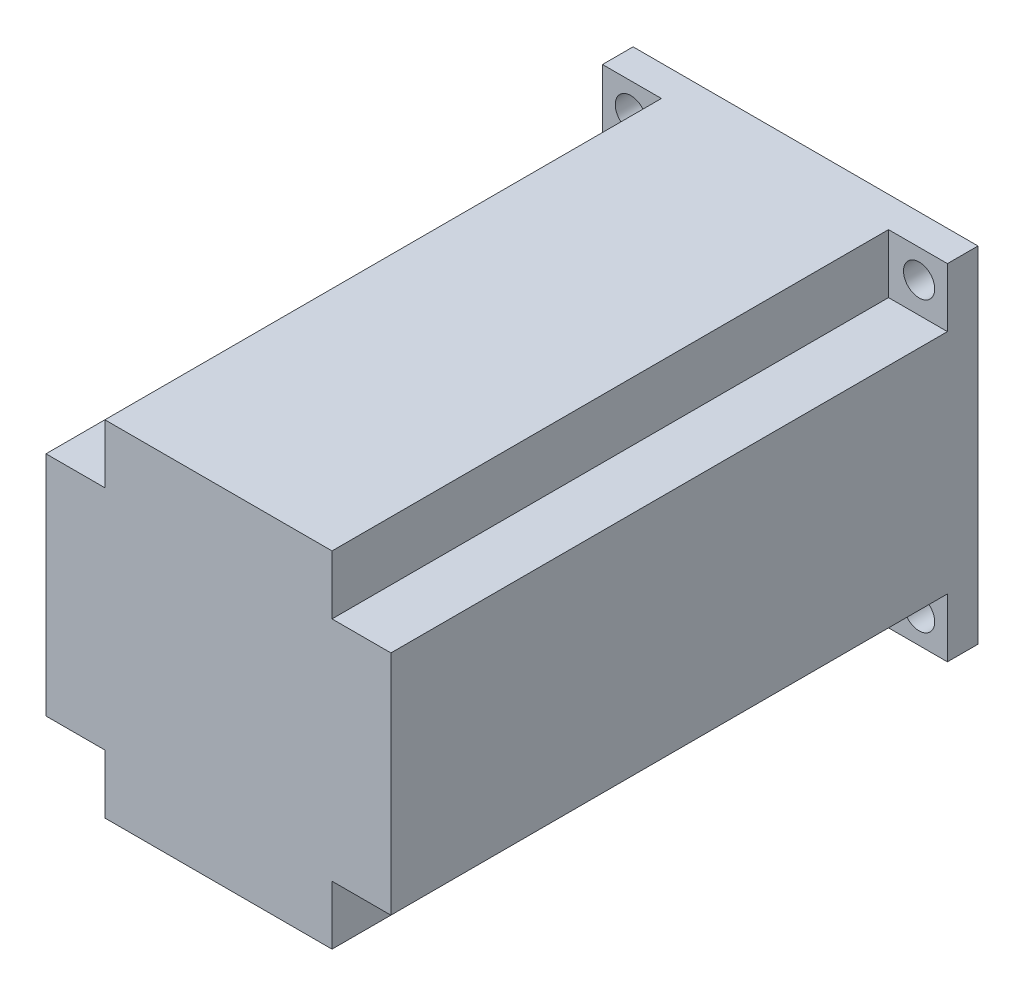
ISO-10303-21;
HEADER;
FILE_DESCRIPTION(('STEP AP214'),'2;1');
FILE_NAME('part.step','',(''),(''),'','','');
FILE_SCHEMA(('AUTOMOTIVE_DESIGN { 1 0 10303 214 1 1 1 1 }'));
ENDSEC;
DATA;
#1=APPLICATION_CONTEXT('core data for automotive mechanical design processes');
#2=APPLICATION_PROTOCOL_DEFINITION('international standard','automotive_design',2000,#1);
#3=PRODUCT_CONTEXT('',#1,'mechanical');
#4=PRODUCT('Part','Part','',(#3));
#5=PRODUCT_RELATED_PRODUCT_CATEGORY('part','',(#4));
#6=PRODUCT_DEFINITION_FORMATION('','',#4);
#7=PRODUCT_DEFINITION_CONTEXT('part definition',#1,'design');
#8=PRODUCT_DEFINITION('design','',#6,#7);
#9=PRODUCT_DEFINITION_SHAPE('','',#8);
#10=(LENGTH_UNIT() NAMED_UNIT(*) SI_UNIT(.MILLI.,.METRE.));
#11=(NAMED_UNIT(*) PLANE_ANGLE_UNIT() SI_UNIT($,.RADIAN.));
#12=(NAMED_UNIT(*) SI_UNIT($,.STERADIAN.) SOLID_ANGLE_UNIT());
#13=UNCERTAINTY_MEASURE_WITH_UNIT(LENGTH_MEASURE(1.E-05),#10,'distance_accuracy_value','');
#14=(GEOMETRIC_REPRESENTATION_CONTEXT(3) GLOBAL_UNCERTAINTY_ASSIGNED_CONTEXT((#13)) GLOBAL_UNIT_ASSIGNED_CONTEXT((#10,
#11,#12)) REPRESENTATION_CONTEXT('',''));
#15=CARTESIAN_POINT('',(0.,0.,0.));
#16=DIRECTION('',(0.,0.,1.));
#17=DIRECTION('',(1.,0.,0.));
#18=AXIS2_PLACEMENT_3D('',#15,#16,#17);
#19=CARTESIAN_POINT('',(0.,0.,96.));
#20=DIRECTION('',(0.,0.,1.));
#21=DIRECTION('',(1.,0.,0.));
#22=AXIS2_PLACEMENT_3D('',#19,#20,#21);
#23=PLANE('',#22);
#24=DIRECTION('',(-1.,0.,0.));
#25=VECTOR('',#24,1.);
#26=CARTESIAN_POINT('',(-28.2,28.2,96.));
#27=LINE('',#26,#25);
#28=CARTESIAN_POINT('',(18.5699999999986,28.2,96.));
#29=VERTEX_POINT('',#28);
#30=CARTESIAN_POINT('',(-18.57,28.2,96.));
#31=VERTEX_POINT('',#30);
#32=EDGE_CURVE('E271',#29,#31,#27,.T.);
#33=ORIENTED_EDGE('',*,*,#32,.T.);
#34=DIRECTION('',(0.,-1.,0.));
#35=VECTOR('',#34,1.);
#36=CARTESIAN_POINT('',(-18.57,28.5699999999986,96.));
#37=LINE('',#36,#35);
#38=CARTESIAN_POINT('',(-18.57,18.5699999999986,96.));
#39=VERTEX_POINT('',#38);
#40=EDGE_CURVE('E223',#31,#39,#37,.T.);
#41=ORIENTED_EDGE('',*,*,#40,.T.);
#42=DIRECTION('',(1.,0.,0.));
#43=VECTOR('',#42,1.);
#44=CARTESIAN_POINT('',(-28.57,18.5699999999986,96.));
#45=LINE('',#44,#43);
#46=CARTESIAN_POINT('',(-28.2,18.5699999999986,96.));
#47=VERTEX_POINT('',#46);
#48=EDGE_CURVE('E202',#47,#39,#45,.T.);
#49=ORIENTED_EDGE('',*,*,#48,.F.);
#50=DIRECTION('',(0.,-1.,0.));
#51=VECTOR('',#50,1.);
#52=CARTESIAN_POINT('',(-28.2,28.2,96.));
#53=LINE('',#52,#51);
#54=CARTESIAN_POINT('',(-28.2,-18.57,96.));
#55=VERTEX_POINT('',#54);
#56=EDGE_CURVE('E274',#47,#55,#53,.T.);
#57=ORIENTED_EDGE('',*,*,#56,.T.);
#58=DIRECTION('',(1.,0.,0.));
#59=VECTOR('',#58,1.);
#60=CARTESIAN_POINT('',(0.,-18.57,96.));
#61=LINE('',#60,#59);
#62=CARTESIAN_POINT('',(-18.5699999999976,-18.57,96.));
#63=VERTEX_POINT('',#62);
#64=EDGE_CURVE('E177',#55,#63,#61,.T.);
#65=ORIENTED_EDGE('',*,*,#64,.T.);
#66=DIRECTION('',(0.,1.,0.));
#67=VECTOR('',#66,1.);
#68=CARTESIAN_POINT('',(-18.5699999999976,0.,96.));
#69=LINE('',#68,#67);
#70=CARTESIAN_POINT('',(-18.5699999999976,-28.2,96.));
#71=VERTEX_POINT('',#70);
#72=EDGE_CURVE('E180',#71,#63,#69,.T.);
#73=ORIENTED_EDGE('',*,*,#72,.F.);
#74=DIRECTION('',(1.,0.,0.));
#75=VECTOR('',#74,1.);
#76=CARTESIAN_POINT('',(-28.2,-28.2,96.));
#77=LINE('',#76,#75);
#78=CARTESIAN_POINT('',(18.570000000001,-28.2,96.));
#79=VERTEX_POINT('',#78);
#80=EDGE_CURVE('E176',#71,#79,#77,.T.);
#81=ORIENTED_EDGE('',*,*,#80,.T.);
#82=DIRECTION('',(0.,1.,0.));
#83=VECTOR('',#82,1.);
#84=CARTESIAN_POINT('',(18.570000000001,0.,96.));
#85=LINE('',#84,#83);
#86=CARTESIAN_POINT('',(18.570000000001,-18.5699999999976,96.));
#87=VERTEX_POINT('',#86);
#88=EDGE_CURVE('E155',#79,#87,#85,.T.);
#89=ORIENTED_EDGE('',*,*,#88,.T.);
#90=DIRECTION('',(-1.,0.,0.));
#91=VECTOR('',#90,1.);
#92=CARTESIAN_POINT('',(0.,-18.5699999999976,96.));
#93=LINE('',#92,#91);
#94=CARTESIAN_POINT('',(28.2,-18.5699999999976,96.));
#95=VERTEX_POINT('',#94);
#96=EDGE_CURVE('E165',#95,#87,#93,.T.);
#97=ORIENTED_EDGE('',*,*,#96,.F.);
#98=DIRECTION('',(0.,1.,0.));
#99=VECTOR('',#98,1.);
#100=CARTESIAN_POINT('',(28.2,28.2,96.));
#101=LINE('',#100,#99);
#102=CARTESIAN_POINT('',(28.2,18.570000000001,96.));
#103=VERTEX_POINT('',#102);
#104=EDGE_CURVE('E269',#95,#103,#101,.T.);
#105=ORIENTED_EDGE('',*,*,#104,.T.);
#106=DIRECTION('',(-1.,0.,0.));
#107=VECTOR('',#106,1.);
#108=CARTESIAN_POINT('',(0.,18.570000000001,96.));
#109=LINE('',#108,#107);
#110=CARTESIAN_POINT('',(18.5699999999986,18.570000000001,96.));
#111=VERTEX_POINT('',#110);
#112=EDGE_CURVE('E162',#103,#111,#109,.T.);
#113=ORIENTED_EDGE('',*,*,#112,.T.);
#114=DIRECTION('',(0.,-1.,0.));
#115=VECTOR('',#114,1.);
#116=CARTESIAN_POINT('',(18.5699999999987,0.,96.));
#117=LINE('',#116,#115);
#118=EDGE_CURVE('E203',#29,#111,#117,.T.);
#119=ORIENTED_EDGE('',*,*,#118,.F.);
#120=EDGE_LOOP('',(#33,#41,#49,#57,#65,#73,#81,#89,#97,#105,#113,#119));
#121=FACE_BOUND('',#120,.T.);
#122=ADVANCED_FACE('F36',(#121),#23,.T.);
#123=CARTESIAN_POINT('',(28.2,28.2,96.));
#124=DIRECTION('',(-1.,0.,0.));
#125=DIRECTION('',(0.,-1.,0.));
#126=AXIS2_PLACEMENT_3D('',#123,#124,#125);
#127=PLANE('',#126);
#128=DIRECTION('',(0.,0.,1.));
#129=VECTOR('',#128,1.);
#130=CARTESIAN_POINT('',(28.2,18.570000000001,5.));
#131=LINE('',#130,#129);
#132=CARTESIAN_POINT('',(28.2,18.570000000001,5.));
#133=VERTEX_POINT('',#132);
#134=EDGE_CURVE('E194',#133,#103,#131,.T.);
#135=ORIENTED_EDGE('',*,*,#134,.T.);
#136=ORIENTED_EDGE('',*,*,#104,.F.);
#137=DIRECTION('',(0.,0.,1.));
#138=VECTOR('',#137,1.);
#139=CARTESIAN_POINT('',(28.2,-18.5699999999976,5.));
#140=LINE('',#139,#138);
#141=CARTESIAN_POINT('',(28.2,-18.5699999999976,5.));
#142=VERTEX_POINT('',#141);
#143=EDGE_CURVE('E161',#142,#95,#140,.T.);
#144=ORIENTED_EDGE('',*,*,#143,.F.);
#145=DIRECTION('',(0.,1.,0.));
#146=VECTOR('',#145,1.);
#147=CARTESIAN_POINT('',(28.2,0.,5.));
#148=LINE('',#147,#146);
#149=CARTESIAN_POINT('',(28.2,-28.2,5.));
#150=VERTEX_POINT('',#149);
#151=EDGE_CURVE('E189',#150,#142,#148,.T.);
#152=ORIENTED_EDGE('',*,*,#151,.F.);
#153=DIRECTION('',(0.,0.,-1.));
#154=VECTOR('',#153,1.);
#155=CARTESIAN_POINT('',(28.2,-28.2,96.));
#156=LINE('',#155,#154);
#157=CARTESIAN_POINT('',(28.2,-28.2,0.));
#158=VERTEX_POINT('',#157);
#159=EDGE_CURVE('E278',#150,#158,#156,.T.);
#160=ORIENTED_EDGE('',*,*,#159,.T.);
#161=DIRECTION('',(0.,1.,0.));
#162=VECTOR('',#161,1.);
#163=CARTESIAN_POINT('',(28.2,28.2,0.));
#164=LINE('',#163,#162);
#165=CARTESIAN_POINT('',(28.2,28.2,0.));
#166=VERTEX_POINT('',#165);
#167=EDGE_CURVE('E268',#158,#166,#164,.T.);
#168=ORIENTED_EDGE('',*,*,#167,.T.);
#169=DIRECTION('',(0.,0.,-1.));
#170=VECTOR('',#169,1.);
#171=CARTESIAN_POINT('',(28.2,28.2,96.));
#172=LINE('',#171,#170);
#173=CARTESIAN_POINT('',(28.2,28.2,5.));
#174=VERTEX_POINT('',#173);
#175=EDGE_CURVE('E294',#174,#166,#172,.T.);
#176=ORIENTED_EDGE('',*,*,#175,.F.);
#177=DIRECTION('',(0.,1.,0.));
#178=VECTOR('',#177,1.);
#179=CARTESIAN_POINT('',(28.2,0.,5.));
#180=LINE('',#179,#178);
#181=EDGE_CURVE('E51',#133,#174,#180,.T.);
#182=ORIENTED_EDGE('',*,*,#181,.F.);
#183=EDGE_LOOP('',(#135,#136,#144,#152,#160,#168,#176,#182));
#184=FACE_BOUND('',#183,.T.);
#185=ADVANCED_FACE('F38',(#184),#127,.F.);
#186=CARTESIAN_POINT('',(-28.2,28.2,96.));
#187=DIRECTION('',(0.,-1.,0.));
#188=DIRECTION('',(0.,0.,-1.));
#189=AXIS2_PLACEMENT_3D('',#186,#187,#188);
#190=PLANE('',#189);
#191=DIRECTION('',(0.,0.,-1.));
#192=VECTOR('',#191,1.);
#193=CARTESIAN_POINT('',(-18.57,28.2,96.));
#194=LINE('',#193,#192);
#195=CARTESIAN_POINT('',(-18.57,28.2,5.));
#196=VERTEX_POINT('',#195);
#197=EDGE_CURVE('E44',#31,#196,#194,.T.);
#198=ORIENTED_EDGE('',*,*,#197,.F.);
#199=ORIENTED_EDGE('',*,*,#32,.F.);
#200=DIRECTION('',(0.,0.,1.));
#201=VECTOR('',#200,1.);
#202=CARTESIAN_POINT('',(18.5699999999986,28.2,5.));
#203=LINE('',#202,#201);
#204=CARTESIAN_POINT('',(18.5699999999986,28.2,5.));
#205=VERTEX_POINT('',#204);
#206=EDGE_CURVE('E198',#205,#29,#203,.T.);
#207=ORIENTED_EDGE('',*,*,#206,.F.);
#208=DIRECTION('',(-1.,0.,0.));
#209=VECTOR('',#208,1.);
#210=CARTESIAN_POINT('',(0.,28.2,5.));
#211=LINE('',#210,#209);
#212=EDGE_CURVE('E214',#174,#205,#211,.T.);
#213=ORIENTED_EDGE('',*,*,#212,.F.);
#214=ORIENTED_EDGE('',*,*,#175,.T.);
#215=DIRECTION('',(-1.,0.,0.));
#216=VECTOR('',#215,1.);
#217=CARTESIAN_POINT('',(-28.2,28.2,0.));
#218=LINE('',#217,#216);
#219=CARTESIAN_POINT('',(-28.2,28.2,0.));
#220=VERTEX_POINT('',#219);
#221=EDGE_CURVE('E281',#166,#220,#218,.T.);
#222=ORIENTED_EDGE('',*,*,#221,.T.);
#223=DIRECTION('',(0.,0.,-1.));
#224=VECTOR('',#223,1.);
#225=CARTESIAN_POINT('',(-28.2,28.2,96.));
#226=LINE('',#225,#224);
#227=CARTESIAN_POINT('',(-28.2,28.2,5.));
#228=VERTEX_POINT('',#227);
#229=EDGE_CURVE('E292',#228,#220,#226,.T.);
#230=ORIENTED_EDGE('',*,*,#229,.F.);
#231=DIRECTION('',(-1.,0.,0.));
#232=VECTOR('',#231,1.);
#233=CARTESIAN_POINT('',(-28.2,28.2,5.));
#234=LINE('',#233,#232);
#235=EDGE_CURVE('E59',#196,#228,#234,.T.);
#236=ORIENTED_EDGE('',*,*,#235,.F.);
#237=EDGE_LOOP('',(#198,#199,#207,#213,#214,#222,#230,#236));
#238=FACE_BOUND('',#237,.T.);
#239=ADVANCED_FACE('F335',(#238),#190,.F.);
#240=CARTESIAN_POINT('',(-28.2,28.2,96.));
#241=DIRECTION('',(1.,0.,0.));
#242=DIRECTION('',(0.,1.,0.));
#243=AXIS2_PLACEMENT_3D('',#240,#241,#242);
#244=PLANE('',#243);
#245=ORIENTED_EDGE('',*,*,#56,.F.);
#246=DIRECTION('',(0.,0.,-1.));
#247=VECTOR('',#246,1.);
#248=CARTESIAN_POINT('',(-28.2,18.5699999999986,96.));
#249=LINE('',#248,#247);
#250=CARTESIAN_POINT('',(-28.2,18.5699999999986,5.));
#251=VERTEX_POINT('',#250);
#252=EDGE_CURVE('E296',#47,#251,#249,.T.);
#253=ORIENTED_EDGE('',*,*,#252,.T.);
#254=DIRECTION('',(0.,-1.,0.));
#255=VECTOR('',#254,1.);
#256=CARTESIAN_POINT('',(-28.2,28.2,5.));
#257=LINE('',#256,#255);
#258=EDGE_CURVE('E253',#228,#251,#257,.T.);
#259=ORIENTED_EDGE('',*,*,#258,.F.);
#260=ORIENTED_EDGE('',*,*,#229,.T.);
#261=DIRECTION('',(0.,-1.,0.));
#262=VECTOR('',#261,1.);
#263=CARTESIAN_POINT('',(-28.2,28.2,0.));
#264=LINE('',#263,#262);
#265=CARTESIAN_POINT('',(-28.2,-28.2,0.));
#266=VERTEX_POINT('',#265);
#267=EDGE_CURVE('E284',#220,#266,#264,.T.);
#268=ORIENTED_EDGE('',*,*,#267,.T.);
#269=DIRECTION('',(0.,0.,-1.));
#270=VECTOR('',#269,1.);
#271=CARTESIAN_POINT('',(-28.2,-28.2,96.));
#272=LINE('',#271,#270);
#273=CARTESIAN_POINT('',(-28.2,-28.2,5.));
#274=VERTEX_POINT('',#273);
#275=EDGE_CURVE('E290',#274,#266,#272,.T.);
#276=ORIENTED_EDGE('',*,*,#275,.F.);
#277=DIRECTION('',(0.,-1.,0.));
#278=VECTOR('',#277,1.);
#279=CARTESIAN_POINT('',(-28.2,0.,5.));
#280=LINE('',#279,#278);
#281=CARTESIAN_POINT('',(-28.2,-18.57,5.));
#282=VERTEX_POINT('',#281);
#283=EDGE_CURVE('E233',#282,#274,#280,.T.);
#284=ORIENTED_EDGE('',*,*,#283,.F.);
#285=DIRECTION('',(0.,0.,1.));
#286=VECTOR('',#285,1.);
#287=CARTESIAN_POINT('',(-28.2,-18.57,5.));
#288=LINE('',#287,#286);
#289=EDGE_CURVE('E242',#282,#55,#288,.T.);
#290=ORIENTED_EDGE('',*,*,#289,.T.);
#291=EDGE_LOOP('',(#245,#253,#259,#260,#268,#276,#284,#290));
#292=FACE_BOUND('',#291,.T.);
#293=ADVANCED_FACE('F346',(#292),#244,.F.);
#294=CARTESIAN_POINT('',(-28.2,-28.2,96.));
#295=DIRECTION('',(0.,1.,0.));
#296=DIRECTION('',(0.,0.,1.));
#297=AXIS2_PLACEMENT_3D('',#294,#295,#296);
#298=PLANE('',#297);
#299=DIRECTION('',(0.,0.,1.));
#300=VECTOR('',#299,1.);
#301=CARTESIAN_POINT('',(18.570000000001,-28.2,5.));
#302=LINE('',#301,#300);
#303=CARTESIAN_POINT('',(18.570000000001,-28.2,5.));
#304=VERTEX_POINT('',#303);
#305=EDGE_CURVE('E187',#304,#79,#302,.T.);
#306=ORIENTED_EDGE('',*,*,#305,.T.);
#307=ORIENTED_EDGE('',*,*,#80,.F.);
#308=DIRECTION('',(0.,0.,1.));
#309=VECTOR('',#308,1.);
#310=CARTESIAN_POINT('',(-18.5699999999976,-28.2,5.));
#311=LINE('',#310,#309);
#312=CARTESIAN_POINT('',(-18.5699999999976,-28.2,5.));
#313=VERTEX_POINT('',#312);
#314=EDGE_CURVE('E249',#313,#71,#311,.T.);
#315=ORIENTED_EDGE('',*,*,#314,.F.);
#316=DIRECTION('',(1.,0.,0.));
#317=VECTOR('',#316,1.);
#318=CARTESIAN_POINT('',(0.,-28.2,5.));
#319=LINE('',#318,#317);
#320=EDGE_CURVE('E235',#274,#313,#319,.T.);
#321=ORIENTED_EDGE('',*,*,#320,.F.);
#322=ORIENTED_EDGE('',*,*,#275,.T.);
#323=DIRECTION('',(1.,0.,0.));
#324=VECTOR('',#323,1.);
#325=CARTESIAN_POINT('',(-28.2,-28.2,0.));
#326=LINE('',#325,#324);
#327=EDGE_CURVE('E272',#266,#158,#326,.T.);
#328=ORIENTED_EDGE('',*,*,#327,.T.);
#329=ORIENTED_EDGE('',*,*,#159,.F.);
#330=DIRECTION('',(1.,0.,0.));
#331=VECTOR('',#330,1.);
#332=CARTESIAN_POINT('',(0.,-28.2,5.));
#333=LINE('',#332,#331);
#334=EDGE_CURVE('E191',#304,#150,#333,.T.);
#335=ORIENTED_EDGE('',*,*,#334,.F.);
#336=EDGE_LOOP('',(#306,#307,#315,#321,#322,#328,#329,#335));
#337=FACE_BOUND('',#336,.T.);
#338=ADVANCED_FACE('F316',(#337),#298,.F.);
#339=CARTESIAN_POINT('',(23.57,23.57,96.));
#340=DIRECTION('',(0.,0.,-1.));
#341=DIRECTION('',(-1.,0.,0.));
#342=AXIS2_PLACEMENT_3D('',#339,#340,#341);
#343=CYLINDRICAL_SURFACE('',#342,2.55);
#344=CARTESIAN_POINT('',(23.57,23.57,0.));
#345=DIRECTION('',(0.,0.,1.));
#346=DIRECTION('',(1.,0.,0.));
#347=AXIS2_PLACEMENT_3D('',#344,#345,#346);
#348=CIRCLE('',#347,2.55);
#349=CARTESIAN_POINT('',(26.12,23.57,0.));
#350=VERTEX_POINT('',#349);
#351=EDGE_CURVE('E265',#350,#350,#348,.T.);
#352=ORIENTED_EDGE('',*,*,#351,.F.);
#353=EDGE_LOOP('',(#352));
#354=FACE_BOUND('',#353,.T.);
#355=CARTESIAN_POINT('',(23.57,23.57,5.));
#356=DIRECTION('',(0.,0.,1.));
#357=DIRECTION('',(1.,0.,0.));
#358=AXIS2_PLACEMENT_3D('',#355,#356,#357);
#359=CIRCLE('',#358,2.55);
#360=CARTESIAN_POINT('',(26.12,23.57,5.));
#361=VERTEX_POINT('',#360);
#362=EDGE_CURVE('E197',#361,#361,#359,.F.);
#363=ORIENTED_EDGE('',*,*,#362,.F.);
#364=EDGE_LOOP('',(#363));
#365=FACE_BOUND('',#364,.T.);
#366=ADVANCED_FACE('F401',(#354,#365),#343,.F.);
#367=CARTESIAN_POINT('',(23.5700000000014,-23.57,96.));
#368=DIRECTION('',(0.,0.,-1.));
#369=DIRECTION('',(-1.,0.,0.));
#370=AXIS2_PLACEMENT_3D('',#367,#368,#369);
#371=CYLINDRICAL_SURFACE('',#370,2.54999999999967);
#372=CARTESIAN_POINT('',(23.5700000000014,-23.57,0.));
#373=DIRECTION('',(0.,0.,1.));
#374=DIRECTION('',(1.,0.,0.));
#375=AXIS2_PLACEMENT_3D('',#372,#373,#374);
#376=CIRCLE('',#375,2.54999999999967);
#377=CARTESIAN_POINT('',(26.120000000001,-23.57,0.));
#378=VERTEX_POINT('',#377);
#379=EDGE_CURVE('E262',#378,#378,#376,.T.);
#380=ORIENTED_EDGE('',*,*,#379,.F.);
#381=EDGE_LOOP('',(#380));
#382=FACE_BOUND('',#381,.T.);
#383=CARTESIAN_POINT('',(23.5700000000014,-23.57,5.));
#384=DIRECTION('',(0.,0.,1.));
#385=DIRECTION('',(1.,0.,0.));
#386=AXIS2_PLACEMENT_3D('',#383,#384,#385);
#387=CIRCLE('',#386,2.54999999999967);
#388=CARTESIAN_POINT('',(26.120000000001,-23.57,5.));
#389=VERTEX_POINT('',#388);
#390=EDGE_CURVE('E183',#389,#389,#387,.F.);
#391=ORIENTED_EDGE('',*,*,#390,.F.);
#392=EDGE_LOOP('',(#391));
#393=FACE_BOUND('',#392,.T.);
#394=ADVANCED_FACE('F426',(#382,#393),#371,.F.);
#395=CARTESIAN_POINT('',(-23.5699999999986,-23.5700000000013,96.));
#396=DIRECTION('',(0.,0.,-1.));
#397=DIRECTION('',(-1.,0.,0.));
#398=AXIS2_PLACEMENT_3D('',#395,#396,#397);
#399=CYLINDRICAL_SURFACE('',#398,2.55000000000102);
#400=CARTESIAN_POINT('',(-23.5699999999986,-23.5700000000013,0.));
#401=DIRECTION('',(0.,0.,1.));
#402=DIRECTION('',(1.,0.,0.));
#403=AXIS2_PLACEMENT_3D('',#400,#401,#402);
#404=CIRCLE('',#403,2.55000000000102);
#405=CARTESIAN_POINT('',(-21.0199999999976,-23.5700000000013,0.));
#406=VERTEX_POINT('',#405);
#407=EDGE_CURVE('E259',#406,#406,#404,.T.);
#408=ORIENTED_EDGE('',*,*,#407,.F.);
#409=EDGE_LOOP('',(#408));
#410=FACE_BOUND('',#409,.T.);
#411=CARTESIAN_POINT('',(-23.5699999999986,-23.5700000000013,5.));
#412=DIRECTION('',(0.,0.,1.));
#413=DIRECTION('',(1.,0.,0.));
#414=AXIS2_PLACEMENT_3D('',#411,#412,#413);
#415=CIRCLE('',#414,2.55000000000102);
#416=CARTESIAN_POINT('',(-21.0199999999976,-23.5700000000013,5.));
#417=VERTEX_POINT('',#416);
#418=EDGE_CURVE('E240',#417,#417,#415,.F.);
#419=ORIENTED_EDGE('',*,*,#418,.F.);
#420=EDGE_LOOP('',(#419));
#421=FACE_BOUND('',#420,.T.);
#422=ADVANCED_FACE('F380',(#410,#421),#399,.F.);
#423=CARTESIAN_POINT('',(-23.57,23.5699999999986,96.));
#424=DIRECTION('',(0.,0.,-1.));
#425=DIRECTION('',(-1.,0.,0.));
#426=AXIS2_PLACEMENT_3D('',#423,#424,#425);
#427=CYLINDRICAL_SURFACE('',#426,2.55000000000145);
#428=CARTESIAN_POINT('',(-23.57,23.5699999999986,0.));
#429=DIRECTION('',(0.,0.,1.));
#430=DIRECTION('',(1.,0.,0.));
#431=AXIS2_PLACEMENT_3D('',#428,#429,#430);
#432=CIRCLE('',#431,2.55000000000145);
#433=CARTESIAN_POINT('',(-21.0199999999986,23.5699999999986,0.));
#434=VERTEX_POINT('',#433);
#435=EDGE_CURVE('E256',#434,#434,#432,.T.);
#436=ORIENTED_EDGE('',*,*,#435,.F.);
#437=EDGE_LOOP('',(#436));
#438=FACE_BOUND('',#437,.T.);
#439=CARTESIAN_POINT('',(-23.57,23.5699999999986,5.));
#440=DIRECTION('',(0.,0.,1.));
#441=DIRECTION('',(1.,0.,0.));
#442=AXIS2_PLACEMENT_3D('',#439,#440,#441);
#443=CIRCLE('',#442,2.55000000000145);
#444=CARTESIAN_POINT('',(-21.0199999999986,23.5699999999986,5.));
#445=VERTEX_POINT('',#444);
#446=EDGE_CURVE('E248',#445,#445,#443,.T.);
#447=ORIENTED_EDGE('',*,*,#446,.T.);
#448=EDGE_LOOP('',(#447));
#449=FACE_BOUND('',#448,.T.);
#450=ADVANCED_FACE('F367',(#438,#449),#427,.F.);
#451=CARTESIAN_POINT('',(0.,0.,0.));
#452=DIRECTION('',(0.,0.,1.));
#453=DIRECTION('',(1.,0.,0.));
#454=AXIS2_PLACEMENT_3D('',#451,#452,#453);
#455=PLANE('',#454);
#456=CARTESIAN_POINT('',(0.,0.,0.));
#457=DIRECTION('',(0.,0.,1.));
#458=DIRECTION('',(1.,0.,0.));
#459=AXIS2_PLACEMENT_3D('',#456,#457,#458);
#460=CIRCLE('',#459,19.05);
#461=CARTESIAN_POINT('',(19.05,0.,0.));
#462=VERTEX_POINT('',#461);
#463=EDGE_CURVE('E11',#462,#462,#460,.F.);
#464=ORIENTED_EDGE('',*,*,#463,.F.);
#465=EDGE_LOOP('',(#464));
#466=FACE_BOUND('',#465,.T.);
#467=ORIENTED_EDGE('',*,*,#167,.F.);
#468=ORIENTED_EDGE('',*,*,#327,.F.);
#469=ORIENTED_EDGE('',*,*,#267,.F.);
#470=ORIENTED_EDGE('',*,*,#221,.F.);
#471=EDGE_LOOP('',(#467,#468,#469,#470));
#472=FACE_BOUND('',#471,.T.);
#473=ORIENTED_EDGE('',*,*,#351,.T.);
#474=EDGE_LOOP('',(#473));
#475=FACE_BOUND('',#474,.T.);
#476=ORIENTED_EDGE('',*,*,#379,.T.);
#477=EDGE_LOOP('',(#476));
#478=FACE_BOUND('',#477,.T.);
#479=ORIENTED_EDGE('',*,*,#407,.T.);
#480=EDGE_LOOP('',(#479));
#481=FACE_BOUND('',#480,.T.);
#482=ORIENTED_EDGE('',*,*,#435,.T.);
#483=EDGE_LOOP('',(#482));
#484=FACE_BOUND('',#483,.T.);
#485=ADVANCED_FACE('F364',(#466,#472,#475,#478,#481,#484),#455,.F.);
#486=CARTESIAN_POINT('',(-18.57,28.5699999999986,5.));
#487=DIRECTION('',(-1.,0.,0.));
#488=DIRECTION('',(0.,0.,1.));
#489=AXIS2_PLACEMENT_3D('',#486,#487,#488);
#490=PLANE('',#489);
#491=ORIENTED_EDGE('',*,*,#197,.T.);
#492=DIRECTION('',(0.,-1.,0.));
#493=VECTOR('',#492,1.);
#494=CARTESIAN_POINT('',(-18.57,28.5699999999986,5.));
#495=LINE('',#494,#493);
#496=CARTESIAN_POINT('',(-18.57,18.5699999999986,5.));
#497=VERTEX_POINT('',#496);
#498=EDGE_CURVE('E221',#196,#497,#495,.T.);
#499=ORIENTED_EDGE('',*,*,#498,.T.);
#500=DIRECTION('',(0.,0.,1.));
#501=VECTOR('',#500,1.);
#502=CARTESIAN_POINT('',(-18.57,18.5699999999986,5.));
#503=LINE('',#502,#501);
#504=EDGE_CURVE('E218',#497,#39,#503,.T.);
#505=ORIENTED_EDGE('',*,*,#504,.T.);
#506=ORIENTED_EDGE('',*,*,#40,.F.);
#507=EDGE_LOOP('',(#491,#499,#505,#506));
#508=FACE_BOUND('',#507,.T.);
#509=ADVANCED_FACE('F340',(#508),#490,.T.);
#510=CARTESIAN_POINT('',(-28.57,18.5699999999986,5.));
#511=DIRECTION('',(0.,-1.,0.));
#512=DIRECTION('',(0.,0.,-1.));
#513=AXIS2_PLACEMENT_3D('',#510,#511,#512);
#514=PLANE('',#513);
#515=ORIENTED_EDGE('',*,*,#48,.T.);
#516=ORIENTED_EDGE('',*,*,#504,.F.);
#517=DIRECTION('',(1.,0.,0.));
#518=VECTOR('',#517,1.);
#519=CARTESIAN_POINT('',(-28.57,18.5699999999986,5.));
#520=LINE('',#519,#518);
#521=EDGE_CURVE('E226',#251,#497,#520,.T.);
#522=ORIENTED_EDGE('',*,*,#521,.F.);
#523=ORIENTED_EDGE('',*,*,#252,.F.);
#524=EDGE_LOOP('',(#515,#516,#522,#523));
#525=FACE_BOUND('',#524,.T.);
#526=ADVANCED_FACE('F344',(#525),#514,.F.);
#527=CARTESIAN_POINT('',(0.,0.,5.));
#528=DIRECTION('',(0.,0.,1.));
#529=DIRECTION('',(1.,0.,0.));
#530=AXIS2_PLACEMENT_3D('',#527,#528,#529);
#531=PLANE('',#530);
#532=ORIENTED_EDGE('',*,*,#446,.F.);
#533=EDGE_LOOP('',(#532));
#534=FACE_BOUND('',#533,.T.);
#535=ORIENTED_EDGE('',*,*,#235,.T.);
#536=ORIENTED_EDGE('',*,*,#258,.T.);
#537=ORIENTED_EDGE('',*,*,#521,.T.);
#538=ORIENTED_EDGE('',*,*,#498,.F.);
#539=EDGE_LOOP('',(#535,#536,#537,#538));
#540=FACE_BOUND('',#539,.T.);
#541=ADVANCED_FACE('F384',(#534,#540),#531,.T.);
#542=CARTESIAN_POINT('',(0.,-18.57,5.));
#543=DIRECTION('',(0.,-1.,0.));
#544=DIRECTION('',(1.,0.,0.));
#545=AXIS2_PLACEMENT_3D('',#542,#543,#544);
#546=PLANE('',#545);
#547=ORIENTED_EDGE('',*,*,#64,.F.);
#548=ORIENTED_EDGE('',*,*,#289,.F.);
#549=DIRECTION('',(1.,0.,0.));
#550=VECTOR('',#549,1.);
#551=CARTESIAN_POINT('',(0.,-18.57,5.));
#552=LINE('',#551,#550);
#553=CARTESIAN_POINT('',(-18.5699999999976,-18.57,5.));
#554=VERTEX_POINT('',#553);
#555=EDGE_CURVE('E231',#282,#554,#552,.T.);
#556=ORIENTED_EDGE('',*,*,#555,.T.);
#557=DIRECTION('',(0.,0.,1.));
#558=VECTOR('',#557,1.);
#559=CARTESIAN_POINT('',(-18.5699999999976,-18.57,5.));
#560=LINE('',#559,#558);
#561=EDGE_CURVE('E246',#554,#63,#560,.T.);
#562=ORIENTED_EDGE('',*,*,#561,.T.);
#563=EDGE_LOOP('',(#547,#548,#556,#562));
#564=FACE_BOUND('',#563,.T.);
#565=ADVANCED_FACE('F350',(#564),#546,.T.);
#566=CARTESIAN_POINT('',(-18.5699999999976,0.,5.));
#567=DIRECTION('',(1.,0.,0.));
#568=DIRECTION('',(0.,1.,0.));
#569=AXIS2_PLACEMENT_3D('',#566,#567,#568);
#570=PLANE('',#569);
#571=ORIENTED_EDGE('',*,*,#72,.T.);
#572=ORIENTED_EDGE('',*,*,#561,.F.);
#573=DIRECTION('',(0.,1.,0.));
#574=VECTOR('',#573,1.);
#575=CARTESIAN_POINT('',(-18.5699999999976,0.,5.));
#576=LINE('',#575,#574);
#577=EDGE_CURVE('E237',#313,#554,#576,.T.);
#578=ORIENTED_EDGE('',*,*,#577,.F.);
#579=ORIENTED_EDGE('',*,*,#314,.T.);
#580=EDGE_LOOP('',(#571,#572,#578,#579));
#581=FACE_BOUND('',#580,.T.);
#582=ADVANCED_FACE('F355',(#581),#570,.F.);
#583=CARTESIAN_POINT('',(0.,0.,5.));
#584=DIRECTION('',(0.,0.,1.));
#585=DIRECTION('',(1.,0.,0.));
#586=AXIS2_PLACEMENT_3D('',#583,#584,#585);
#587=PLANE('',#586);
#588=ORIENTED_EDGE('',*,*,#555,.F.);
#589=ORIENTED_EDGE('',*,*,#283,.T.);
#590=ORIENTED_EDGE('',*,*,#320,.T.);
#591=ORIENTED_EDGE('',*,*,#577,.T.);
#592=EDGE_LOOP('',(#588,#589,#590,#591));
#593=FACE_BOUND('',#592,.T.);
#594=ORIENTED_EDGE('',*,*,#418,.T.);
#595=EDGE_LOOP('',(#594));
#596=FACE_BOUND('',#595,.T.);
#597=ADVANCED_FACE('F478',(#593,#596),#587,.T.);
#598=CARTESIAN_POINT('',(18.570000000001,0.,5.));
#599=DIRECTION('',(1.,0.,0.));
#600=DIRECTION('',(0.,0.,-1.));
#601=AXIS2_PLACEMENT_3D('',#598,#599,#600);
#602=PLANE('',#601);
#603=ORIENTED_EDGE('',*,*,#88,.F.);
#604=ORIENTED_EDGE('',*,*,#305,.F.);
#605=DIRECTION('',(0.,1.,0.));
#606=VECTOR('',#605,1.);
#607=CARTESIAN_POINT('',(18.570000000001,0.,5.));
#608=LINE('',#607,#606);
#609=CARTESIAN_POINT('',(18.570000000001,-18.5699999999976,5.));
#610=VERTEX_POINT('',#609);
#611=EDGE_CURVE('E157',#304,#610,#608,.T.);
#612=ORIENTED_EDGE('',*,*,#611,.T.);
#613=DIRECTION('',(0.,0.,1.));
#614=VECTOR('',#613,1.);
#615=CARTESIAN_POINT('',(18.570000000001,-18.5699999999976,5.));
#616=LINE('',#615,#614);
#617=EDGE_CURVE('E150',#610,#87,#616,.T.);
#618=ORIENTED_EDGE('',*,*,#617,.T.);
#619=EDGE_LOOP('',(#603,#604,#612,#618));
#620=FACE_BOUND('',#619,.T.);
#621=ADVANCED_FACE('F152',(#620),#602,.T.);
#622=CARTESIAN_POINT('',(0.,-18.5699999999976,5.));
#623=DIRECTION('',(0.,1.,0.));
#624=DIRECTION('',(0.,0.,1.));
#625=AXIS2_PLACEMENT_3D('',#622,#623,#624);
#626=PLANE('',#625);
#627=ORIENTED_EDGE('',*,*,#96,.T.);
#628=ORIENTED_EDGE('',*,*,#617,.F.);
#629=DIRECTION('',(-1.,0.,0.));
#630=VECTOR('',#629,1.);
#631=CARTESIAN_POINT('',(0.,-18.5699999999976,5.));
#632=LINE('',#631,#630);
#633=EDGE_CURVE('E186',#142,#610,#632,.T.);
#634=ORIENTED_EDGE('',*,*,#633,.F.);
#635=ORIENTED_EDGE('',*,*,#143,.T.);
#636=EDGE_LOOP('',(#627,#628,#634,#635));
#637=FACE_BOUND('',#636,.T.);
#638=ADVANCED_FACE('F166',(#637),#626,.F.);
#639=CARTESIAN_POINT('',(0.,0.,5.));
#640=DIRECTION('',(0.,0.,1.));
#641=DIRECTION('',(1.,0.,0.));
#642=AXIS2_PLACEMENT_3D('',#639,#640,#641);
#643=PLANE('',#642);
#644=ORIENTED_EDGE('',*,*,#611,.F.);
#645=ORIENTED_EDGE('',*,*,#334,.T.);
#646=ORIENTED_EDGE('',*,*,#151,.T.);
#647=ORIENTED_EDGE('',*,*,#633,.T.);
#648=EDGE_LOOP('',(#644,#645,#646,#647));
#649=FACE_BOUND('',#648,.T.);
#650=ORIENTED_EDGE('',*,*,#390,.T.);
#651=EDGE_LOOP('',(#650));
#652=FACE_BOUND('',#651,.T.);
#653=ADVANCED_FACE('F321',(#649,#652),#643,.T.);
#654=CARTESIAN_POINT('',(0.,18.570000000001,5.));
#655=DIRECTION('',(0.,1.,0.));
#656=DIRECTION('',(-1.,0.,0.));
#657=AXIS2_PLACEMENT_3D('',#654,#655,#656);
#658=PLANE('',#657);
#659=ORIENTED_EDGE('',*,*,#112,.F.);
#660=ORIENTED_EDGE('',*,*,#134,.F.);
#661=DIRECTION('',(-1.,0.,0.));
#662=VECTOR('',#661,1.);
#663=CARTESIAN_POINT('',(0.,18.570000000001,5.));
#664=LINE('',#663,#662);
#665=CARTESIAN_POINT('',(18.5699999999986,18.570000000001,5.));
#666=VERTEX_POINT('',#665);
#667=EDGE_CURVE('E206',#133,#666,#664,.T.);
#668=ORIENTED_EDGE('',*,*,#667,.T.);
#669=DIRECTION('',(0.,0.,1.));
#670=VECTOR('',#669,1.);
#671=CARTESIAN_POINT('',(18.5699999999986,18.570000000001,5.));
#672=LINE('',#671,#670);
#673=EDGE_CURVE('E200',#666,#111,#672,.T.);
#674=ORIENTED_EDGE('',*,*,#673,.T.);
#675=EDGE_LOOP('',(#659,#660,#668,#674));
#676=FACE_BOUND('',#675,.T.);
#677=ADVANCED_FACE('F327',(#676),#658,.T.);
#678=CARTESIAN_POINT('',(18.5699999999987,0.,5.));
#679=DIRECTION('',(-1.,0.,0.));
#680=DIRECTION('',(0.,-1.,0.));
#681=AXIS2_PLACEMENT_3D('',#678,#679,#680);
#682=PLANE('',#681);
#683=ORIENTED_EDGE('',*,*,#118,.T.);
#684=ORIENTED_EDGE('',*,*,#673,.F.);
#685=DIRECTION('',(0.,-1.,0.));
#686=VECTOR('',#685,1.);
#687=CARTESIAN_POINT('',(18.5699999999987,0.,5.));
#688=LINE('',#687,#686);
#689=EDGE_CURVE('E211',#205,#666,#688,.T.);
#690=ORIENTED_EDGE('',*,*,#689,.F.);
#691=ORIENTED_EDGE('',*,*,#206,.T.);
#692=EDGE_LOOP('',(#683,#684,#690,#691));
#693=FACE_BOUND('',#692,.T.);
#694=ADVANCED_FACE('F331',(#693),#682,.F.);
#695=CARTESIAN_POINT('',(0.,0.,5.));
#696=DIRECTION('',(0.,0.,1.));
#697=DIRECTION('',(1.,0.,0.));
#698=AXIS2_PLACEMENT_3D('',#695,#696,#697);
#699=PLANE('',#698);
#700=ORIENTED_EDGE('',*,*,#667,.F.);
#701=ORIENTED_EDGE('',*,*,#181,.T.);
#702=ORIENTED_EDGE('',*,*,#212,.T.);
#703=ORIENTED_EDGE('',*,*,#689,.T.);
#704=EDGE_LOOP('',(#700,#701,#702,#703));
#705=FACE_BOUND('',#704,.T.);
#706=ORIENTED_EDGE('',*,*,#362,.T.);
#707=EDGE_LOOP('',(#706));
#708=FACE_BOUND('',#707,.T.);
#709=ADVANCED_FACE('F526',(#705,#708),#699,.T.);
#710=CARTESIAN_POINT('',(0.,0.,-1.6));
#711=DIRECTION('',(0.,0.,1.));
#712=DIRECTION('',(1.,0.,0.));
#713=AXIS2_PLACEMENT_3D('',#710,#711,#712);
#714=CYLINDRICAL_SURFACE('',#713,19.05);
#715=CARTESIAN_POINT('',(0.,0.,-1.6));
#716=DIRECTION('',(0.,0.,-1.));
#717=DIRECTION('',(-1.,0.,0.));
#718=AXIS2_PLACEMENT_3D('',#715,#716,#717);
#719=CIRCLE('',#718,19.05);
#720=CARTESIAN_POINT('',(-19.05,0.,-1.6));
#721=VERTEX_POINT('',#720);
#722=EDGE_CURVE('E303',#721,#721,#719,.T.);
#723=ORIENTED_EDGE('',*,*,#722,.F.);
#724=EDGE_LOOP('',(#723));
#725=FACE_BOUND('',#724,.T.);
#726=ORIENTED_EDGE('',*,*,#463,.T.);
#727=EDGE_LOOP('',(#726));
#728=FACE_BOUND('',#727,.T.);
#729=ADVANCED_FACE('F534',(#725,#728),#714,.T.);
#730=CARTESIAN_POINT('',(0.,0.,-1.6));
#731=DIRECTION('',(0.,0.,-1.));
#732=DIRECTION('',(-1.,0.,0.));
#733=AXIS2_PLACEMENT_3D('',#730,#731,#732);
#734=PLANE('',#733);
#735=CARTESIAN_POINT('',(0.,0.,-1.6));
#736=DIRECTION('',(0.,0.,-1.));
#737=DIRECTION('',(-1.,0.,0.));
#738=AXIS2_PLACEMENT_3D('',#735,#736,#737);
#739=CIRCLE('',#738,4.);
#740=CARTESIAN_POINT('',(4.,0.,-1.6));
#741=VERTEX_POINT('',#740);
#742=EDGE_CURVE('E301',#741,#741,#739,.T.);
#743=ORIENTED_EDGE('',*,*,#742,.F.);
#744=EDGE_LOOP('',(#743));
#745=FACE_BOUND('',#744,.T.);
#746=ORIENTED_EDGE('',*,*,#722,.T.);
#747=EDGE_LOOP('',(#746));
#748=FACE_BOUND('',#747,.T.);
#749=ADVANCED_FACE('F546',(#745,#748),#734,.T.);
#750=CARTESIAN_POINT('',(0.,0.,-21.));
#751=DIRECTION('',(0.,0.,-1.));
#752=DIRECTION('',(-1.,0.,0.));
#753=AXIS2_PLACEMENT_3D('',#750,#751,#752);
#754=PLANE('',#753);
#755=CARTESIAN_POINT('',(0.,0.,-21.));
#756=DIRECTION('',(0.,0.,-1.));
#757=DIRECTION('',(-1.,0.,0.));
#758=AXIS2_PLACEMENT_3D('',#755,#756,#757);
#759=CIRCLE('',#758,4.);
#760=CARTESIAN_POINT('',(4.,0.,-21.));
#761=VERTEX_POINT('',#760);
#762=EDGE_CURVE('E222',#761,#761,#759,.T.);
#763=ORIENTED_EDGE('',*,*,#762,.T.);
#764=EDGE_LOOP('',(#763));
#765=FACE_BOUND('',#764,.T.);
#766=ADVANCED_FACE('F541',(#765),#754,.T.);
#767=CARTESIAN_POINT('',(0.,0.,-21.));
#768=DIRECTION('',(0.,0.,1.));
#769=DIRECTION('',(1.,0.,0.));
#770=AXIS2_PLACEMENT_3D('',#767,#768,#769);
#771=CYLINDRICAL_SURFACE('',#770,4.);
#772=CARTESIAN_POINT('',(4.,0.,-1.6));
#773=CARTESIAN_POINT('',(4.,0.,-1.80208333333333));
#774=CARTESIAN_POINT('',(4.,0.,-2.00416666666666));
#775=CARTESIAN_POINT('',(4.,0.,-2.40833333333333));
#776=CARTESIAN_POINT('',(4.,0.,-2.61041666666666));
#777=CARTESIAN_POINT('',(4.,0.,-3.01458333333333));
#778=CARTESIAN_POINT('',(4.,0.,-3.21666666666667));
#779=CARTESIAN_POINT('',(4.,0.,-3.62083333333333));
#780=CARTESIAN_POINT('',(4.,0.,-3.82291666666666));
#781=CARTESIAN_POINT('',(4.,0.,-4.22708333333333));
#782=CARTESIAN_POINT('',(4.,0.,-4.42916666666666));
#783=CARTESIAN_POINT('',(4.,0.,-4.83333333333333));
#784=CARTESIAN_POINT('',(4.,0.,-5.03541666666666));
#785=CARTESIAN_POINT('',(4.,0.,-5.43958333333333));
#786=CARTESIAN_POINT('',(4.,0.,-5.64166666666666));
#787=CARTESIAN_POINT('',(4.,0.,-6.04583333333333));
#788=CARTESIAN_POINT('',(4.,0.,-6.24791666666666));
#789=CARTESIAN_POINT('',(4.,0.,-6.65208333333333));
#790=CARTESIAN_POINT('',(4.,0.,-6.85416666666666));
#791=CARTESIAN_POINT('',(4.,0.,-7.25833333333333));
#792=CARTESIAN_POINT('',(4.,0.,-7.46041666666666));
#793=CARTESIAN_POINT('',(4.,0.,-7.86458333333333));
#794=CARTESIAN_POINT('',(4.,0.,-8.06666666666666));
#795=CARTESIAN_POINT('',(4.,0.,-8.47083333333333));
#796=CARTESIAN_POINT('',(4.,0.,-8.67291666666666));
#797=CARTESIAN_POINT('',(4.,0.,-9.07708333333333));
#798=CARTESIAN_POINT('',(4.,0.,-9.27916666666666));
#799=CARTESIAN_POINT('',(4.,0.,-9.68333333333333));
#800=CARTESIAN_POINT('',(4.,0.,-9.88541666666666));
#801=CARTESIAN_POINT('',(4.,0.,-10.2895833333333));
#802=CARTESIAN_POINT('',(4.,0.,-10.4916666666667));
#803=CARTESIAN_POINT('',(4.,0.,-10.8958333333333));
#804=CARTESIAN_POINT('',(4.,0.,-11.0979166666667));
#805=CARTESIAN_POINT('',(4.,0.,-11.5020833333333));
#806=CARTESIAN_POINT('',(4.,0.,-11.7041666666667));
#807=CARTESIAN_POINT('',(4.,0.,-12.1083333333333));
#808=CARTESIAN_POINT('',(4.,0.,-12.3104166666667));
#809=CARTESIAN_POINT('',(4.,0.,-12.7145833333333));
#810=CARTESIAN_POINT('',(4.,0.,-12.9166666666667));
#811=CARTESIAN_POINT('',(4.,0.,-13.3208333333333));
#812=CARTESIAN_POINT('',(4.,0.,-13.5229166666667));
#813=CARTESIAN_POINT('',(4.,0.,-13.9270833333333));
#814=CARTESIAN_POINT('',(4.,0.,-14.1291666666667));
#815=CARTESIAN_POINT('',(4.,0.,-14.5333333333333));
#816=CARTESIAN_POINT('',(4.,0.,-14.7354166666667));
#817=CARTESIAN_POINT('',(4.,0.,-15.1395833333333));
#818=CARTESIAN_POINT('',(4.,0.,-15.3416666666667));
#819=CARTESIAN_POINT('',(4.,0.,-15.7458333333333));
#820=CARTESIAN_POINT('',(4.,0.,-15.9479166666667));
#821=CARTESIAN_POINT('',(4.,0.,-16.3520833333333));
#822=CARTESIAN_POINT('',(4.,0.,-16.5541666666667));
#823=CARTESIAN_POINT('',(4.,0.,-16.9583333333333));
#824=CARTESIAN_POINT('',(4.,0.,-17.1604166666667));
#825=CARTESIAN_POINT('',(4.,0.,-17.5645833333333));
#826=CARTESIAN_POINT('',(4.,0.,-17.7666666666667));
#827=CARTESIAN_POINT('',(4.,0.,-18.1708333333333));
#828=CARTESIAN_POINT('',(4.,0.,-18.3729166666667));
#829=CARTESIAN_POINT('',(4.,0.,-18.7770833333333));
#830=CARTESIAN_POINT('',(4.,0.,-18.9791666666667));
#831=CARTESIAN_POINT('',(4.,0.,-19.3833333333333));
#832=CARTESIAN_POINT('',(4.,0.,-19.5854166666667));
#833=CARTESIAN_POINT('',(4.,0.,-19.9895833333333));
#834=CARTESIAN_POINT('',(4.,0.,-20.1916666666667));
#835=CARTESIAN_POINT('',(4.,0.,-20.5958333333333));
#836=CARTESIAN_POINT('',(4.,0.,-20.7979166666667));
#837=CARTESIAN_POINT('',(4.,0.,-21.));
#838=B_SPLINE_CURVE_WITH_KNOTS('',3,(#772,#773,#774,#775,#776,#777,#778,#779,#780,#781,#782,
#783,#784,#785,#786,#787,#788,#789,#790,#791,#792,#793,#794,#795,#796,#797,#798,#799,#800,#801,
#802,#803,#804,#805,#806,#807,#808,#809,#810,#811,#812,#813,#814,#815,#816,#817,#818,#819,#820,
#821,#822,#823,#824,#825,#826,#827,#828,#829,#830,#831,#832,#833,#834,#835,#836,#837),
.UNSPECIFIED.,.F.,.F.,(4,2,2,2,2,2,2,2,2,2,2,2,2,2,2,2,2,2,2,2,2,2,2,2,2,2,2,2,2,2,2,2,4),(0.,
0.606249999999999,1.2125,1.81875,2.425,3.03125,3.6375,4.24375,4.85,5.45625,6.0625,6.66875,7.275,
7.88125,8.4875,9.09375,9.7,10.30625,10.9125,11.51875,12.125,12.73125,13.3375,13.94375,14.55,
15.15625,15.7625,16.36875,16.975,17.58125,18.1875,18.79375,19.4),.UNSPECIFIED.);
#839=EDGE_CURVE('BSEAM545',#741,#761,#838,.T.);
#840=ORIENTED_EDGE('',*,*,#742,.T.);
#841=ORIENTED_EDGE('',*,*,#762,.F.);
#842=ORIENTED_EDGE('',*,*,#839,.T.);
#843=ORIENTED_EDGE('',*,*,#839,.F.);
#844=EDGE_LOOP('',(#840,#842,#841,#843));
#845=FACE_BOUND('',#844,.T.);
#846=ADVANCED_FACE('F545',(#845),#771,.T.);
#847=CLOSED_SHELL('',(#122,#185,#239,#293,#338,#366,#394,#422,#450,#485,#509,#526,#541,#565,
#582,#597,#621,#638,#653,#677,#694,#709,#729,#749,#766,#846));
#848=MANIFOLD_SOLID_BREP('B2',#847);
#849=ADVANCED_BREP_SHAPE_REPRESENTATION('',(#18,#848),#14);
#850=SHAPE_DEFINITION_REPRESENTATION(#9,#849);
ENDSEC;
END-ISO-10303-21;
